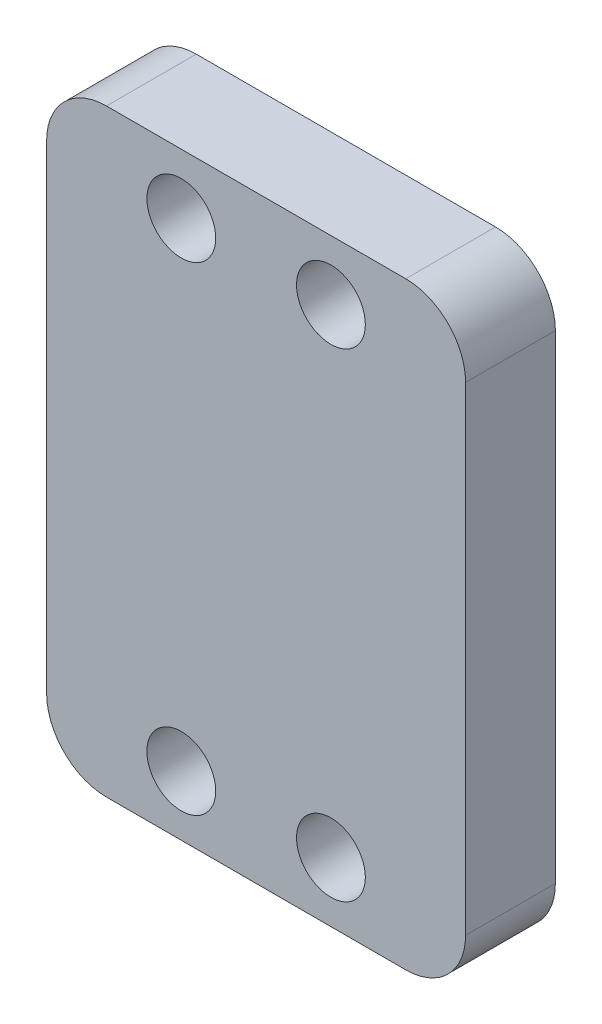
ISO-10303-21;
HEADER;
FILE_DESCRIPTION(('STEP AP214'),'2;1');
FILE_NAME('part.step','',(''),(''),'','','');
FILE_SCHEMA(('AUTOMOTIVE_DESIGN { 1 0 10303 214 1 1 1 1 }'));
ENDSEC;
DATA;
#1=APPLICATION_CONTEXT('core data for automotive mechanical design processes');
#2=APPLICATION_PROTOCOL_DEFINITION('international standard','automotive_design',2000,#1);
#3=PRODUCT_CONTEXT('',#1,'mechanical');
#4=PRODUCT('Part','Part','',(#3));
#5=PRODUCT_RELATED_PRODUCT_CATEGORY('part','',(#4));
#6=PRODUCT_DEFINITION_FORMATION('','',#4);
#7=PRODUCT_DEFINITION_CONTEXT('part definition',#1,'design');
#8=PRODUCT_DEFINITION('design','',#6,#7);
#9=PRODUCT_DEFINITION_SHAPE('','',#8);
#10=(LENGTH_UNIT() NAMED_UNIT(*) SI_UNIT(.MILLI.,.METRE.));
#11=(NAMED_UNIT(*) PLANE_ANGLE_UNIT() SI_UNIT($,.RADIAN.));
#12=(NAMED_UNIT(*) SI_UNIT($,.STERADIAN.) SOLID_ANGLE_UNIT());
#13=UNCERTAINTY_MEASURE_WITH_UNIT(LENGTH_MEASURE(1.E-05),#10,'distance_accuracy_value','');
#14=(GEOMETRIC_REPRESENTATION_CONTEXT(3) GLOBAL_UNCERTAINTY_ASSIGNED_CONTEXT((#13)) GLOBAL_UNIT_ASSIGNED_CONTEXT((#10,
#11,#12)) REPRESENTATION_CONTEXT('',''));
#15=CARTESIAN_POINT('',(0.,0.,0.));
#16=DIRECTION('',(0.,0.,1.));
#17=DIRECTION('',(1.,0.,0.));
#18=AXIS2_PLACEMENT_3D('',#15,#16,#17);
#19=CARTESIAN_POINT('',(7.,-10.,1.5));
#20=DIRECTION('',(-1.,0.,0.));
#21=DIRECTION('',(0.,0.,1.));
#22=AXIS2_PLACEMENT_3D('',#19,#20,#21);
#23=PLANE('',#22);
#24=DIRECTION('',(0.,1.,0.));
#25=VECTOR('',#24,1.);
#26=CARTESIAN_POINT('',(7.,-10.,1.5));
#27=LINE('',#26,#25);
#28=CARTESIAN_POINT('',(7.,-8.,1.5));
#29=VERTEX_POINT('',#28);
#30=CARTESIAN_POINT('',(7.,8.,1.5));
#31=VERTEX_POINT('',#30);
#32=EDGE_CURVE('E137',#29,#31,#27,.T.);
#33=ORIENTED_EDGE('',*,*,#32,.F.);
#34=DIRECTION('',(0.,0.,-1.));
#35=VECTOR('',#34,1.);
#36=CARTESIAN_POINT('',(7.,-8.,1.5));
#37=LINE('',#36,#35);
#38=CARTESIAN_POINT('',(7.,-8.,-1.5));
#39=VERTEX_POINT('',#38);
#40=EDGE_CURVE('E177',#29,#39,#37,.T.);
#41=ORIENTED_EDGE('',*,*,#40,.T.);
#42=DIRECTION('',(0.,1.,0.));
#43=VECTOR('',#42,1.);
#44=CARTESIAN_POINT('',(7.,-10.,-1.5));
#45=LINE('',#44,#43);
#46=CARTESIAN_POINT('',(7.,8.,-1.5));
#47=VERTEX_POINT('',#46);
#48=EDGE_CURVE('E193',#39,#47,#45,.T.);
#49=ORIENTED_EDGE('',*,*,#48,.T.);
#50=DIRECTION('',(0.,0.,-1.));
#51=VECTOR('',#50,1.);
#52=CARTESIAN_POINT('',(7.,8.,1.5));
#53=LINE('',#52,#51);
#54=EDGE_CURVE('E174',#47,#31,#53,.F.);
#55=ORIENTED_EDGE('',*,*,#54,.T.);
#56=EDGE_LOOP('',(#33,#41,#49,#55));
#57=FACE_BOUND('',#56,.T.);
#58=ADVANCED_FACE('F41',(#57),#23,.F.);
#59=CARTESIAN_POINT('',(-7.,10.,1.5));
#60=DIRECTION('',(0.,-1.,0.));
#61=DIRECTION('',(0.,0.,-1.));
#62=AXIS2_PLACEMENT_3D('',#59,#60,#61);
#63=PLANE('',#62);
#64=DIRECTION('',(-1.,0.,0.));
#65=VECTOR('',#64,1.);
#66=CARTESIAN_POINT('',(-7.,10.,1.5));
#67=LINE('',#66,#65);
#68=CARTESIAN_POINT('',(5.,10.,1.5));
#69=VERTEX_POINT('',#68);
#70=CARTESIAN_POINT('',(-5.,10.,1.5));
#71=VERTEX_POINT('',#70);
#72=EDGE_CURVE('E143',#69,#71,#67,.T.);
#73=ORIENTED_EDGE('',*,*,#72,.F.);
#74=DIRECTION('',(0.,0.,-1.));
#75=VECTOR('',#74,1.);
#76=CARTESIAN_POINT('',(5.,10.,1.5));
#77=LINE('',#76,#75);
#78=CARTESIAN_POINT('',(5.,10.,-1.5));
#79=VERTEX_POINT('',#78);
#80=EDGE_CURVE('E11',#69,#79,#77,.T.);
#81=ORIENTED_EDGE('',*,*,#80,.T.);
#82=DIRECTION('',(-1.,0.,0.));
#83=VECTOR('',#82,1.);
#84=CARTESIAN_POINT('',(-7.,10.,-1.5));
#85=LINE('',#84,#83);
#86=CARTESIAN_POINT('',(-5.,10.,-1.5));
#87=VERTEX_POINT('',#86);
#88=EDGE_CURVE('E146',#79,#87,#85,.T.);
#89=ORIENTED_EDGE('',*,*,#88,.T.);
#90=DIRECTION('',(0.,0.,-1.));
#91=VECTOR('',#90,1.);
#92=CARTESIAN_POINT('',(-5.,10.,1.5));
#93=LINE('',#92,#91);
#94=EDGE_CURVE('E50',#87,#71,#93,.F.);
#95=ORIENTED_EDGE('',*,*,#94,.T.);
#96=EDGE_LOOP('',(#73,#81,#89,#95));
#97=FACE_BOUND('',#96,.T.);
#98=ADVANCED_FACE('F232',(#97),#63,.F.);
#99=CARTESIAN_POINT('',(-7.,-10.,1.5));
#100=DIRECTION('',(1.,0.,0.));
#101=DIRECTION('',(0.,0.,-1.));
#102=AXIS2_PLACEMENT_3D('',#99,#100,#101);
#103=PLANE('',#102);
#104=DIRECTION('',(0.,-1.,0.));
#105=VECTOR('',#104,1.);
#106=CARTESIAN_POINT('',(-7.,-10.,-1.5));
#107=LINE('',#106,#105);
#108=CARTESIAN_POINT('',(-7.,8.,-1.5));
#109=VERTEX_POINT('',#108);
#110=CARTESIAN_POINT('',(-7.,-8.,-1.5));
#111=VERTEX_POINT('',#110);
#112=EDGE_CURVE('E138',#109,#111,#107,.T.);
#113=ORIENTED_EDGE('',*,*,#112,.T.);
#114=DIRECTION('',(0.,0.,-1.));
#115=VECTOR('',#114,1.);
#116=CARTESIAN_POINT('',(-7.,-8.,1.5));
#117=LINE('',#116,#115);
#118=CARTESIAN_POINT('',(-7.,-8.,1.5));
#119=VERTEX_POINT('',#118);
#120=EDGE_CURVE('E113',#111,#119,#117,.F.);
#121=ORIENTED_EDGE('',*,*,#120,.T.);
#122=DIRECTION('',(0.,-1.,0.));
#123=VECTOR('',#122,1.);
#124=CARTESIAN_POINT('',(-7.,-10.,1.5));
#125=LINE('',#124,#123);
#126=CARTESIAN_POINT('',(-7.,8.,1.5));
#127=VERTEX_POINT('',#126);
#128=EDGE_CURVE('E196',#127,#119,#125,.T.);
#129=ORIENTED_EDGE('',*,*,#128,.F.);
#130=DIRECTION('',(0.,0.,-1.));
#131=VECTOR('',#130,1.);
#132=CARTESIAN_POINT('',(-7.,8.,1.5));
#133=LINE('',#132,#131);
#134=EDGE_CURVE('E119',#127,#109,#133,.T.);
#135=ORIENTED_EDGE('',*,*,#134,.T.);
#136=EDGE_LOOP('',(#113,#121,#129,#135));
#137=FACE_BOUND('',#136,.T.);
#138=ADVANCED_FACE('F229',(#137),#103,.F.);
#139=CARTESIAN_POINT('',(-7.,-10.,1.5));
#140=DIRECTION('',(0.,1.,0.));
#141=DIRECTION('',(0.,0.,1.));
#142=AXIS2_PLACEMENT_3D('',#139,#140,#141);
#143=PLANE('',#142);
#144=DIRECTION('',(1.,0.,0.));
#145=VECTOR('',#144,1.);
#146=CARTESIAN_POINT('',(-7.,-10.,1.5));
#147=LINE('',#146,#145);
#148=CARTESIAN_POINT('',(-5.,-10.,1.5));
#149=VERTEX_POINT('',#148);
#150=CARTESIAN_POINT('',(5.,-10.,1.5));
#151=VERTEX_POINT('',#150);
#152=EDGE_CURVE('E129',#149,#151,#147,.T.);
#153=ORIENTED_EDGE('',*,*,#152,.F.);
#154=DIRECTION('',(0.,0.,-1.));
#155=VECTOR('',#154,1.);
#156=CARTESIAN_POINT('',(-5.,-10.,1.5));
#157=LINE('',#156,#155);
#158=CARTESIAN_POINT('',(-5.,-10.,-1.5));
#159=VERTEX_POINT('',#158);
#160=EDGE_CURVE('E112',#149,#159,#157,.T.);
#161=ORIENTED_EDGE('',*,*,#160,.T.);
#162=DIRECTION('',(1.,0.,0.));
#163=VECTOR('',#162,1.);
#164=CARTESIAN_POINT('',(-7.,-10.,-1.5));
#165=LINE('',#164,#163);
#166=CARTESIAN_POINT('',(5.,-10.,-1.5));
#167=VERTEX_POINT('',#166);
#168=EDGE_CURVE('E126',#159,#167,#165,.T.);
#169=ORIENTED_EDGE('',*,*,#168,.T.);
#170=DIRECTION('',(0.,0.,-1.));
#171=VECTOR('',#170,1.);
#172=CARTESIAN_POINT('',(5.,-10.,1.5));
#173=LINE('',#172,#171);
#174=EDGE_CURVE('E132',#167,#151,#173,.F.);
#175=ORIENTED_EDGE('',*,*,#174,.T.);
#176=EDGE_LOOP('',(#153,#161,#169,#175));
#177=FACE_BOUND('',#176,.T.);
#178=ADVANCED_FACE('F125',(#177),#143,.F.);
#179=CARTESIAN_POINT('',(0.,0.,1.5));
#180=DIRECTION('',(0.,0.,-1.));
#181=DIRECTION('',(-1.,0.,0.));
#182=AXIS2_PLACEMENT_3D('',#179,#180,#181);
#183=PLANE('',#182);
#184=CARTESIAN_POINT('',(2.5,8.,1.5));
#185=DIRECTION('',(0.,0.,1.));
#186=DIRECTION('',(1.,0.,0.));
#187=AXIS2_PLACEMENT_3D('',#184,#185,#186);
#188=CIRCLE('',#187,1.15);
#189=CARTESIAN_POINT('',(3.65,8.,1.5));
#190=VERTEX_POINT('',#189);
#191=EDGE_CURVE('E185',#190,#190,#188,.T.);
#192=ORIENTED_EDGE('',*,*,#191,.F.);
#193=EDGE_LOOP('',(#192));
#194=FACE_BOUND('',#193,.T.);
#195=CARTESIAN_POINT('',(-2.5,-8.,1.5));
#196=DIRECTION('',(0.,0.,1.));
#197=DIRECTION('',(1.,0.,0.));
#198=AXIS2_PLACEMENT_3D('',#195,#196,#197);
#199=CIRCLE('',#198,1.15);
#200=CARTESIAN_POINT('',(-1.35,-8.,1.5));
#201=VERTEX_POINT('',#200);
#202=EDGE_CURVE('E186',#201,#201,#199,.T.);
#203=ORIENTED_EDGE('',*,*,#202,.F.);
#204=EDGE_LOOP('',(#203));
#205=FACE_BOUND('',#204,.T.);
#206=CARTESIAN_POINT('',(2.5,-8.,1.5));
#207=DIRECTION('',(0.,0.,1.));
#208=DIRECTION('',(1.,0.,0.));
#209=AXIS2_PLACEMENT_3D('',#206,#207,#208);
#210=CIRCLE('',#209,1.15);
#211=CARTESIAN_POINT('',(3.65,-8.,1.5));
#212=VERTEX_POINT('',#211);
#213=EDGE_CURVE('E188',#212,#212,#210,.T.);
#214=ORIENTED_EDGE('',*,*,#213,.F.);
#215=EDGE_LOOP('',(#214));
#216=FACE_BOUND('',#215,.T.);
#217=CARTESIAN_POINT('',(-2.5,8.,1.5));
#218=DIRECTION('',(0.,0.,1.));
#219=DIRECTION('',(1.,0.,0.));
#220=AXIS2_PLACEMENT_3D('',#217,#218,#219);
#221=CIRCLE('',#220,1.15);
#222=CARTESIAN_POINT('',(-1.35,8.,1.5));
#223=VERTEX_POINT('',#222);
#224=EDGE_CURVE('E204',#223,#223,#221,.T.);
#225=ORIENTED_EDGE('',*,*,#224,.F.);
#226=EDGE_LOOP('',(#225));
#227=FACE_BOUND('',#226,.T.);
#228=ORIENTED_EDGE('',*,*,#128,.T.);
#229=CARTESIAN_POINT('',(-5.,-8.,1.5));
#230=DIRECTION('',(0.,0.,-1.));
#231=DIRECTION('',(-1.,0.,0.));
#232=AXIS2_PLACEMENT_3D('',#229,#230,#231);
#233=CIRCLE('',#232,2.);
#234=EDGE_CURVE('E171',#119,#149,#233,.F.);
#235=ORIENTED_EDGE('',*,*,#234,.T.);
#236=ORIENTED_EDGE('',*,*,#152,.T.);
#237=CARTESIAN_POINT('',(5.,-8.,1.5));
#238=DIRECTION('',(0.,0.,-1.));
#239=DIRECTION('',(-1.,0.,0.));
#240=AXIS2_PLACEMENT_3D('',#237,#238,#239);
#241=CIRCLE('',#240,2.);
#242=EDGE_CURVE('E168',#151,#29,#241,.F.);
#243=ORIENTED_EDGE('',*,*,#242,.T.);
#244=ORIENTED_EDGE('',*,*,#32,.T.);
#245=CARTESIAN_POINT('',(5.,8.,1.5));
#246=DIRECTION('',(0.,0.,-1.));
#247=DIRECTION('',(-1.,0.,0.));
#248=AXIS2_PLACEMENT_3D('',#245,#246,#247);
#249=CIRCLE('',#248,2.);
#250=EDGE_CURVE('E63',#31,#69,#249,.F.);
#251=ORIENTED_EDGE('',*,*,#250,.T.);
#252=ORIENTED_EDGE('',*,*,#72,.T.);
#253=CARTESIAN_POINT('',(-5.,8.,1.5));
#254=DIRECTION('',(0.,0.,-1.));
#255=DIRECTION('',(-1.,0.,0.));
#256=AXIS2_PLACEMENT_3D('',#253,#254,#255);
#257=CIRCLE('',#256,2.);
#258=EDGE_CURVE('E164',#71,#127,#257,.F.);
#259=ORIENTED_EDGE('',*,*,#258,.T.);
#260=EDGE_LOOP('',(#228,#235,#236,#243,#244,#251,#252,#259));
#261=FACE_BOUND('',#260,.T.);
#262=ADVANCED_FACE('F225',(#194,#205,#216,#227,#261),#183,.F.);
#263=CARTESIAN_POINT('',(0.,0.,-1.5));
#264=DIRECTION('',(0.,0.,-1.));
#265=DIRECTION('',(-1.,0.,0.));
#266=AXIS2_PLACEMENT_3D('',#263,#264,#265);
#267=PLANE('',#266);
#268=CARTESIAN_POINT('',(2.5,8.,-1.5));
#269=DIRECTION('',(0.,0.,1.));
#270=DIRECTION('',(1.,0.,0.));
#271=AXIS2_PLACEMENT_3D('',#268,#269,#270);
#272=CIRCLE('',#271,1.15);
#273=CARTESIAN_POINT('',(3.65,8.,-1.5));
#274=VERTEX_POINT('',#273);
#275=EDGE_CURVE('E199',#274,#274,#272,.T.);
#276=ORIENTED_EDGE('',*,*,#275,.T.);
#277=EDGE_LOOP('',(#276));
#278=FACE_BOUND('',#277,.T.);
#279=CARTESIAN_POINT('',(-2.5,-8.,-1.5));
#280=DIRECTION('',(0.,0.,1.));
#281=DIRECTION('',(1.,0.,0.));
#282=AXIS2_PLACEMENT_3D('',#279,#280,#281);
#283=CIRCLE('',#282,1.15);
#284=CARTESIAN_POINT('',(-1.35,-8.,-1.5));
#285=VERTEX_POINT('',#284);
#286=EDGE_CURVE('E182',#285,#285,#283,.T.);
#287=ORIENTED_EDGE('',*,*,#286,.T.);
#288=EDGE_LOOP('',(#287));
#289=FACE_BOUND('',#288,.T.);
#290=CARTESIAN_POINT('',(2.5,-8.,-1.5));
#291=DIRECTION('',(0.,0.,1.));
#292=DIRECTION('',(1.,0.,0.));
#293=AXIS2_PLACEMENT_3D('',#290,#291,#292);
#294=CIRCLE('',#293,1.15);
#295=CARTESIAN_POINT('',(3.65,-8.,-1.5));
#296=VERTEX_POINT('',#295);
#297=EDGE_CURVE('E191',#296,#296,#294,.T.);
#298=ORIENTED_EDGE('',*,*,#297,.T.);
#299=EDGE_LOOP('',(#298));
#300=FACE_BOUND('',#299,.T.);
#301=CARTESIAN_POINT('',(-2.5,8.,-1.5));
#302=DIRECTION('',(0.,0.,1.));
#303=DIRECTION('',(1.,0.,0.));
#304=AXIS2_PLACEMENT_3D('',#301,#302,#303);
#305=CIRCLE('',#304,1.15);
#306=CARTESIAN_POINT('',(-1.35,8.,-1.5));
#307=VERTEX_POINT('',#306);
#308=EDGE_CURVE('E212',#307,#307,#305,.T.);
#309=ORIENTED_EDGE('',*,*,#308,.T.);
#310=EDGE_LOOP('',(#309));
#311=FACE_BOUND('',#310,.T.);
#312=ORIENTED_EDGE('',*,*,#168,.F.);
#313=CARTESIAN_POINT('',(-5.,-8.,-1.5));
#314=DIRECTION('',(0.,0.,-1.));
#315=DIRECTION('',(-1.,0.,0.));
#316=AXIS2_PLACEMENT_3D('',#313,#314,#315);
#317=CIRCLE('',#316,2.);
#318=EDGE_CURVE('E108',#159,#111,#317,.T.);
#319=ORIENTED_EDGE('',*,*,#318,.T.);
#320=ORIENTED_EDGE('',*,*,#112,.F.);
#321=CARTESIAN_POINT('',(-5.,8.,-1.5));
#322=DIRECTION('',(0.,0.,-1.));
#323=DIRECTION('',(-1.,0.,0.));
#324=AXIS2_PLACEMENT_3D('',#321,#322,#323);
#325=CIRCLE('',#324,2.);
#326=EDGE_CURVE('E131',#109,#87,#325,.T.);
#327=ORIENTED_EDGE('',*,*,#326,.T.);
#328=ORIENTED_EDGE('',*,*,#88,.F.);
#329=CARTESIAN_POINT('',(5.,8.,-1.5));
#330=DIRECTION('',(0.,0.,-1.));
#331=DIRECTION('',(-1.,0.,0.));
#332=AXIS2_PLACEMENT_3D('',#329,#330,#331);
#333=CIRCLE('',#332,2.);
#334=EDGE_CURVE('E154',#79,#47,#333,.T.);
#335=ORIENTED_EDGE('',*,*,#334,.T.);
#336=ORIENTED_EDGE('',*,*,#48,.F.);
#337=CARTESIAN_POINT('',(5.,-8.,-1.5));
#338=DIRECTION('',(0.,0.,-1.));
#339=DIRECTION('',(-1.,0.,0.));
#340=AXIS2_PLACEMENT_3D('',#337,#338,#339);
#341=CIRCLE('',#340,2.);
#342=EDGE_CURVE('E120',#39,#167,#341,.T.);
#343=ORIENTED_EDGE('',*,*,#342,.T.);
#344=EDGE_LOOP('',(#312,#319,#320,#327,#328,#335,#336,#343));
#345=FACE_BOUND('',#344,.T.);
#346=ADVANCED_FACE('F134',(#278,#289,#300,#311,#345),#267,.T.);
#347=CARTESIAN_POINT('',(-2.5,8.,-1.5));
#348=DIRECTION('',(0.,0.,1.));
#349=DIRECTION('',(1.,0.,0.));
#350=AXIS2_PLACEMENT_3D('',#347,#348,#349);
#351=CYLINDRICAL_SURFACE('',#350,1.15);
#352=ORIENTED_EDGE('',*,*,#308,.F.);
#353=EDGE_LOOP('',(#352));
#354=FACE_BOUND('',#353,.T.);
#355=ORIENTED_EDGE('',*,*,#224,.T.);
#356=EDGE_LOOP('',(#355));
#357=FACE_BOUND('',#356,.T.);
#358=ADVANCED_FACE('F264',(#354,#357),#351,.F.);
#359=CARTESIAN_POINT('',(2.5,-8.,-1.5));
#360=DIRECTION('',(0.,0.,1.));
#361=DIRECTION('',(1.,0.,0.));
#362=AXIS2_PLACEMENT_3D('',#359,#360,#361);
#363=CYLINDRICAL_SURFACE('',#362,1.15);
#364=ORIENTED_EDGE('',*,*,#297,.F.);
#365=EDGE_LOOP('',(#364));
#366=FACE_BOUND('',#365,.T.);
#367=ORIENTED_EDGE('',*,*,#213,.T.);
#368=EDGE_LOOP('',(#367));
#369=FACE_BOUND('',#368,.T.);
#370=ADVANCED_FACE('F271',(#366,#369),#363,.F.);
#371=CARTESIAN_POINT('',(-2.5,-8.,-1.5));
#372=DIRECTION('',(0.,0.,1.));
#373=DIRECTION('',(1.,0.,0.));
#374=AXIS2_PLACEMENT_3D('',#371,#372,#373);
#375=CYLINDRICAL_SURFACE('',#374,1.15);
#376=ORIENTED_EDGE('',*,*,#286,.F.);
#377=EDGE_LOOP('',(#376));
#378=FACE_BOUND('',#377,.T.);
#379=ORIENTED_EDGE('',*,*,#202,.T.);
#380=EDGE_LOOP('',(#379));
#381=FACE_BOUND('',#380,.T.);
#382=ADVANCED_FACE('F273',(#378,#381),#375,.F.);
#383=CARTESIAN_POINT('',(2.5,8.,-1.5));
#384=DIRECTION('',(0.,0.,1.));
#385=DIRECTION('',(1.,0.,0.));
#386=AXIS2_PLACEMENT_3D('',#383,#384,#385);
#387=CYLINDRICAL_SURFACE('',#386,1.15);
#388=ORIENTED_EDGE('',*,*,#275,.F.);
#389=EDGE_LOOP('',(#388));
#390=FACE_BOUND('',#389,.T.);
#391=ORIENTED_EDGE('',*,*,#191,.T.);
#392=EDGE_LOOP('',(#391));
#393=FACE_BOUND('',#392,.T.);
#394=ADVANCED_FACE('F249',(#390,#393),#387,.F.);
#395=CARTESIAN_POINT('',(-5.,-8.,1.5));
#396=DIRECTION('',(0.,0.,-1.));
#397=DIRECTION('',(-1.,0.,0.));
#398=AXIS2_PLACEMENT_3D('',#395,#396,#397);
#399=CYLINDRICAL_SURFACE('',#398,2.);
#400=ORIENTED_EDGE('',*,*,#234,.F.);
#401=ORIENTED_EDGE('',*,*,#120,.F.);
#402=ORIENTED_EDGE('',*,*,#318,.F.);
#403=ORIENTED_EDGE('',*,*,#160,.F.);
#404=EDGE_LOOP('',(#400,#401,#402,#403));
#405=FACE_BOUND('',#404,.T.);
#406=ADVANCED_FACE('F111',(#405),#399,.T.);
#407=CARTESIAN_POINT('',(5.,-8.,1.5));
#408=DIRECTION('',(0.,0.,-1.));
#409=DIRECTION('',(-1.,0.,0.));
#410=AXIS2_PLACEMENT_3D('',#407,#408,#409);
#411=CYLINDRICAL_SURFACE('',#410,2.);
#412=ORIENTED_EDGE('',*,*,#242,.F.);
#413=ORIENTED_EDGE('',*,*,#174,.F.);
#414=ORIENTED_EDGE('',*,*,#342,.F.);
#415=ORIENTED_EDGE('',*,*,#40,.F.);
#416=EDGE_LOOP('',(#412,#413,#414,#415));
#417=FACE_BOUND('',#416,.T.);
#418=ADVANCED_FACE('F242',(#417),#411,.T.);
#419=CARTESIAN_POINT('',(5.,8.,1.5));
#420=DIRECTION('',(0.,0.,-1.));
#421=DIRECTION('',(-1.,0.,0.));
#422=AXIS2_PLACEMENT_3D('',#419,#420,#421);
#423=CYLINDRICAL_SURFACE('',#422,2.);
#424=ORIENTED_EDGE('',*,*,#250,.F.);
#425=ORIENTED_EDGE('',*,*,#54,.F.);
#426=ORIENTED_EDGE('',*,*,#334,.F.);
#427=ORIENTED_EDGE('',*,*,#80,.F.);
#428=EDGE_LOOP('',(#424,#425,#426,#427));
#429=FACE_BOUND('',#428,.T.);
#430=ADVANCED_FACE('F235',(#429),#423,.T.);
#431=CARTESIAN_POINT('',(-5.,8.,1.5));
#432=DIRECTION('',(0.,0.,-1.));
#433=DIRECTION('',(-1.,0.,0.));
#434=AXIS2_PLACEMENT_3D('',#431,#432,#433);
#435=CYLINDRICAL_SURFACE('',#434,2.);
#436=ORIENTED_EDGE('',*,*,#258,.F.);
#437=ORIENTED_EDGE('',*,*,#94,.F.);
#438=ORIENTED_EDGE('',*,*,#326,.F.);
#439=ORIENTED_EDGE('',*,*,#134,.F.);
#440=EDGE_LOOP('',(#436,#437,#438,#439));
#441=FACE_BOUND('',#440,.T.);
#442=ADVANCED_FACE('F43',(#441),#435,.T.);
#443=CLOSED_SHELL('',(#58,#98,#138,#178,#262,#346,#358,#370,#382,#394,#406,#418,#430,#442));
#444=MANIFOLD_SOLID_BREP('B2',#443);
#445=ADVANCED_BREP_SHAPE_REPRESENTATION('',(#18,#444),#14);
#446=SHAPE_DEFINITION_REPRESENTATION(#9,#445);
ENDSEC;
END-ISO-10303-21;
